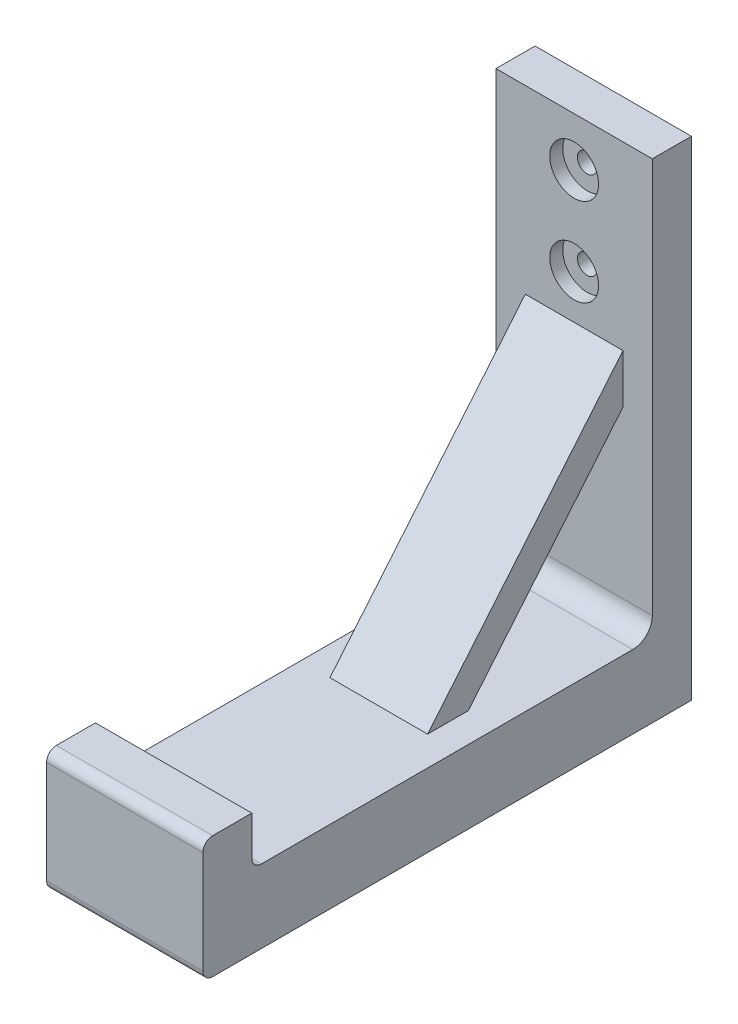
ISO-10303-21;
HEADER;
FILE_DESCRIPTION(('STEP AP214'),'2;1');
FILE_NAME('part.step','',(''),(''),'','','');
FILE_SCHEMA(('AUTOMOTIVE_DESIGN { 1 0 10303 214 1 1 1 1 }'));
ENDSEC;
DATA;
#1=APPLICATION_CONTEXT('core data for automotive mechanical design processes');
#2=APPLICATION_PROTOCOL_DEFINITION('international standard','automotive_design',2000,#1);
#3=PRODUCT_CONTEXT('',#1,'mechanical');
#4=PRODUCT('Part','Part','',(#3));
#5=PRODUCT_RELATED_PRODUCT_CATEGORY('part','',(#4));
#6=PRODUCT_DEFINITION_FORMATION('','',#4);
#7=PRODUCT_DEFINITION_CONTEXT('part definition',#1,'design');
#8=PRODUCT_DEFINITION('design','',#6,#7);
#9=PRODUCT_DEFINITION_SHAPE('','',#8);
#10=(LENGTH_UNIT() NAMED_UNIT(*) SI_UNIT(.MILLI.,.METRE.));
#11=(NAMED_UNIT(*) PLANE_ANGLE_UNIT() SI_UNIT($,.RADIAN.));
#12=(NAMED_UNIT(*) SI_UNIT($,.STERADIAN.) SOLID_ANGLE_UNIT());
#13=UNCERTAINTY_MEASURE_WITH_UNIT(LENGTH_MEASURE(1.E-05),#10,'distance_accuracy_value','');
#14=(GEOMETRIC_REPRESENTATION_CONTEXT(3) GLOBAL_UNCERTAINTY_ASSIGNED_CONTEXT((#13)) GLOBAL_UNIT_ASSIGNED_CONTEXT((#10,
#11,#12)) REPRESENTATION_CONTEXT('',''));
#15=CARTESIAN_POINT('',(0.,0.,0.));
#16=DIRECTION('',(0.,0.,1.));
#17=DIRECTION('',(1.,0.,0.));
#18=AXIS2_PLACEMENT_3D('',#15,#16,#17);
#19=CARTESIAN_POINT('',(20.32,127.,10.16));
#20=DIRECTION('',(0.,0.,-1.));
#21=DIRECTION('',(0.,1.,0.));
#22=AXIS2_PLACEMENT_3D('',#19,#20,#21);
#23=PLANE('',#22);
#24=CARTESIAN_POINT('',(0.,91.44,10.16));
#25=DIRECTION('',(0.,0.,1.));
#26=DIRECTION('',(1.,0.,0.));
#27=AXIS2_PLACEMENT_3D('',#24,#25,#26);
#28=CIRCLE('',#27,6.35);
#29=CARTESIAN_POINT('',(6.35,91.44,10.16));
#30=VERTEX_POINT('',#29);
#31=EDGE_CURVE('E361',#30,#30,#28,.T.);
#32=ORIENTED_EDGE('',*,*,#31,.F.);
#33=EDGE_LOOP('',(#32));
#34=FACE_BOUND('',#33,.T.);
#35=CARTESIAN_POINT('',(0.,114.3,10.16));
#36=DIRECTION('',(0.,0.,1.));
#37=DIRECTION('',(1.,0.,0.));
#38=AXIS2_PLACEMENT_3D('',#35,#36,#37);
#39=CIRCLE('',#38,6.35);
#40=CARTESIAN_POINT('',(6.35,114.3,10.16));
#41=VERTEX_POINT('',#40);
#42=EDGE_CURVE('E343',#41,#41,#39,.T.);
#43=ORIENTED_EDGE('',*,*,#42,.F.);
#44=EDGE_LOOP('',(#43));
#45=FACE_BOUND('',#44,.T.);
#46=DIRECTION('',(0.,-1.,0.));
#47=VECTOR('',#46,1.);
#48=CARTESIAN_POINT('',(-20.32,127.,10.16));
#49=LINE('',#48,#47);
#50=CARTESIAN_POINT('',(-20.32,127.,10.16));
#51=VERTEX_POINT('',#50);
#52=CARTESIAN_POINT('',(-20.32,24.13,10.16));
#53=VERTEX_POINT('',#52);
#54=EDGE_CURVE('E240',#51,#53,#49,.T.);
#55=ORIENTED_EDGE('',*,*,#54,.T.);
#56=DIRECTION('',(-1.,0.,0.));
#57=VECTOR('',#56,1.);
#58=CARTESIAN_POINT('',(20.32,24.13,10.16));
#59=LINE('',#58,#57);
#60=CARTESIAN_POINT('',(20.32,24.13,10.16));
#61=VERTEX_POINT('',#60);
#62=EDGE_CURVE('E275',#53,#61,#59,.F.);
#63=ORIENTED_EDGE('',*,*,#62,.T.);
#64=DIRECTION('',(0.,-1.,0.));
#65=VECTOR('',#64,1.);
#66=CARTESIAN_POINT('',(20.32,127.,10.16));
#67=LINE('',#66,#65);
#68=CARTESIAN_POINT('',(20.32,127.,10.16));
#69=VERTEX_POINT('',#68);
#70=EDGE_CURVE('E212',#69,#61,#67,.T.);
#71=ORIENTED_EDGE('',*,*,#70,.F.);
#72=DIRECTION('',(-1.,0.,0.));
#73=VECTOR('',#72,1.);
#74=CARTESIAN_POINT('',(20.32,127.,10.16));
#75=LINE('',#74,#73);
#76=EDGE_CURVE('E257',#69,#51,#75,.T.);
#77=ORIENTED_EDGE('',*,*,#76,.T.);
#78=EDGE_LOOP('',(#55,#63,#71,#77));
#79=FACE_BOUND('',#78,.T.);
#80=DIRECTION('',(-1.,0.,0.));
#81=VECTOR('',#80,1.);
#82=CARTESIAN_POINT('',(12.7,80.01,10.16));
#83=LINE('',#82,#81);
#84=CARTESIAN_POINT('',(12.7,80.01,10.16));
#85=VERTEX_POINT('',#84);
#86=CARTESIAN_POINT('',(-12.7,80.01,10.16));
#87=VERTEX_POINT('',#86);
#88=EDGE_CURVE('E167',#85,#87,#83,.T.);
#89=ORIENTED_EDGE('',*,*,#88,.F.);
#90=DIRECTION('',(0.,1.,0.));
#91=VECTOR('',#90,1.);
#92=CARTESIAN_POINT('',(12.7,67.31,10.16));
#93=LINE('',#92,#91);
#94=CARTESIAN_POINT('',(12.7,67.31,10.16));
#95=VERTEX_POINT('',#94);
#96=EDGE_CURVE('E165',#95,#85,#93,.T.);
#97=ORIENTED_EDGE('',*,*,#96,.F.);
#98=DIRECTION('',(-1.,0.,0.));
#99=VECTOR('',#98,1.);
#100=CARTESIAN_POINT('',(12.7,67.31,10.16));
#101=LINE('',#100,#99);
#102=CARTESIAN_POINT('',(-12.7,67.31,10.16));
#103=VERTEX_POINT('',#102);
#104=EDGE_CURVE('E156',#95,#103,#101,.T.);
#105=ORIENTED_EDGE('',*,*,#104,.T.);
#106=DIRECTION('',(0.,1.,0.));
#107=VECTOR('',#106,1.);
#108=CARTESIAN_POINT('',(-12.7,67.31,10.16));
#109=LINE('',#108,#107);
#110=EDGE_CURVE('E163',#103,#87,#109,.T.);
#111=ORIENTED_EDGE('',*,*,#110,.T.);
#112=EDGE_LOOP('',(#89,#97,#105,#111));
#113=FACE_BOUND('',#112,.T.);
#114=ADVANCED_FACE('F44',(#34,#45,#79,#113),#23,.F.);
#115=CARTESIAN_POINT('',(20.32,19.05,10.16));
#116=DIRECTION('',(0.,-1.,0.));
#117=DIRECTION('',(0.,0.,-1.));
#118=AXIS2_PLACEMENT_3D('',#115,#116,#117);
#119=PLANE('',#118);
#120=DIRECTION('',(0.,0.,1.));
#121=VECTOR('',#120,1.);
#122=CARTESIAN_POINT('',(-20.32,19.05,10.16));
#123=LINE('',#122,#121);
#124=CARTESIAN_POINT('',(-20.32,19.05,15.24));
#125=VERTEX_POINT('',#124);
#126=CARTESIAN_POINT('',(-20.32,19.05,111.76));
#127=VERTEX_POINT('',#126);
#128=EDGE_CURVE('E241',#125,#127,#123,.T.);
#129=ORIENTED_EDGE('',*,*,#128,.T.);
#130=DIRECTION('',(-1.,0.,0.));
#131=VECTOR('',#130,1.);
#132=CARTESIAN_POINT('',(20.32,19.05,111.76));
#133=LINE('',#132,#131);
#134=CARTESIAN_POINT('',(20.32,19.05,111.76));
#135=VERTEX_POINT('',#134);
#136=EDGE_CURVE('E284',#127,#135,#133,.F.);
#137=ORIENTED_EDGE('',*,*,#136,.T.);
#138=DIRECTION('',(0.,0.,1.));
#139=VECTOR('',#138,1.);
#140=CARTESIAN_POINT('',(20.32,19.05,10.16));
#141=LINE('',#140,#139);
#142=CARTESIAN_POINT('',(20.32,19.05,15.24));
#143=VERTEX_POINT('',#142);
#144=EDGE_CURVE('E213',#143,#135,#141,.T.);
#145=ORIENTED_EDGE('',*,*,#144,.F.);
#146=DIRECTION('',(-1.,0.,0.));
#147=VECTOR('',#146,1.);
#148=CARTESIAN_POINT('',(-20.32,19.05,15.24));
#149=LINE('',#148,#147);
#150=EDGE_CURVE('E266',#143,#125,#149,.T.);
#151=ORIENTED_EDGE('',*,*,#150,.T.);
#152=EDGE_LOOP('',(#129,#137,#145,#151));
#153=FACE_BOUND('',#152,.T.);
#154=DIRECTION('',(0.,0.,-1.));
#155=VECTOR('',#154,1.);
#156=CARTESIAN_POINT('',(12.7,19.05,60.96));
#157=LINE('',#156,#155);
#158=CARTESIAN_POINT('',(12.7,19.05,60.96));
#159=VERTEX_POINT('',#158);
#160=CARTESIAN_POINT('',(12.7,19.05,50.3766666666666));
#161=VERTEX_POINT('',#160);
#162=EDGE_CURVE('E189',#159,#161,#157,.T.);
#163=ORIENTED_EDGE('',*,*,#162,.F.);
#164=DIRECTION('',(-1.,0.,0.));
#165=VECTOR('',#164,1.);
#166=CARTESIAN_POINT('',(12.7,19.05,60.96));
#167=LINE('',#166,#165);
#168=CARTESIAN_POINT('',(-12.7,19.05,60.96));
#169=VERTEX_POINT('',#168);
#170=EDGE_CURVE('E195',#159,#169,#167,.T.);
#171=ORIENTED_EDGE('',*,*,#170,.T.);
#172=DIRECTION('',(0.,0.,-1.));
#173=VECTOR('',#172,1.);
#174=CARTESIAN_POINT('',(-12.7,19.05,60.96));
#175=LINE('',#174,#173);
#176=CARTESIAN_POINT('',(-12.7,19.05,50.3766666666667));
#177=VERTEX_POINT('',#176);
#178=EDGE_CURVE('E177',#169,#177,#175,.T.);
#179=ORIENTED_EDGE('',*,*,#178,.T.);
#180=DIRECTION('',(-1.,0.,0.));
#181=VECTOR('',#180,1.);
#182=CARTESIAN_POINT('',(12.7,19.05,50.3766666666667));
#183=LINE('',#182,#181);
#184=EDGE_CURVE('E169',#161,#177,#183,.T.);
#185=ORIENTED_EDGE('',*,*,#184,.F.);
#186=EDGE_LOOP('',(#163,#171,#179,#185));
#187=FACE_BOUND('',#186,.T.);
#188=ADVANCED_FACE('F375',(#153,#187),#119,.F.);
#189=CARTESIAN_POINT('',(20.32,0.,127.));
#190=DIRECTION('',(0.,1.,0.));
#191=DIRECTION('',(0.,0.,1.));
#192=AXIS2_PLACEMENT_3D('',#189,#190,#191);
#193=PLANE('',#192);
#194=DIRECTION('',(0.,0.,-1.));
#195=VECTOR('',#194,1.);
#196=CARTESIAN_POINT('',(20.32,0.,127.));
#197=LINE('',#196,#195);
#198=CARTESIAN_POINT('',(20.32,0.,124.46));
#199=VERTEX_POINT('',#198);
#200=CARTESIAN_POINT('',(20.32,0.,0.));
#201=VERTEX_POINT('',#200);
#202=EDGE_CURVE('E203',#199,#201,#197,.T.);
#203=ORIENTED_EDGE('',*,*,#202,.F.);
#204=DIRECTION('',(-1.,0.,0.));
#205=VECTOR('',#204,1.);
#206=CARTESIAN_POINT('',(20.32,0.,124.46));
#207=LINE('',#206,#205);
#208=CARTESIAN_POINT('',(-20.32,0.,124.46));
#209=VERTEX_POINT('',#208);
#210=EDGE_CURVE('E295',#199,#209,#207,.T.);
#211=ORIENTED_EDGE('',*,*,#210,.T.);
#212=DIRECTION('',(0.,0.,-1.));
#213=VECTOR('',#212,1.);
#214=CARTESIAN_POINT('',(-20.32,0.,127.));
#215=LINE('',#214,#213);
#216=CARTESIAN_POINT('',(-20.32,0.,0.));
#217=VERTEX_POINT('',#216);
#218=EDGE_CURVE('E199',#209,#217,#215,.T.);
#219=ORIENTED_EDGE('',*,*,#218,.T.);
#220=DIRECTION('',(-1.,0.,0.));
#221=VECTOR('',#220,1.);
#222=CARTESIAN_POINT('',(20.32,0.,0.));
#223=LINE('',#222,#221);
#224=EDGE_CURVE('E263',#201,#217,#223,.T.);
#225=ORIENTED_EDGE('',*,*,#224,.F.);
#226=EDGE_LOOP('',(#203,#211,#219,#225));
#227=FACE_BOUND('',#226,.T.);
#228=ADVANCED_FACE('F417',(#227),#193,.F.);
#229=CARTESIAN_POINT('',(20.32,0.,0.));
#230=DIRECTION('',(0.,0.,1.));
#231=DIRECTION('',(1.,0.,0.));
#232=AXIS2_PLACEMENT_3D('',#229,#230,#231);
#233=PLANE('',#232);
#234=CARTESIAN_POINT('',(0.,91.44,0.));
#235=DIRECTION('',(0.,0.,1.));
#236=DIRECTION('',(1.,0.,0.));
#237=AXIS2_PLACEMENT_3D('',#234,#235,#236);
#238=CIRCLE('',#237,2.54);
#239=CARTESIAN_POINT('',(2.54,91.44,0.));
#240=VERTEX_POINT('',#239);
#241=EDGE_CURVE('E353',#240,#240,#238,.T.);
#242=ORIENTED_EDGE('',*,*,#241,.T.);
#243=EDGE_LOOP('',(#242));
#244=FACE_BOUND('',#243,.T.);
#245=CARTESIAN_POINT('',(0.,114.3,0.));
#246=DIRECTION('',(0.,0.,1.));
#247=DIRECTION('',(1.,0.,0.));
#248=AXIS2_PLACEMENT_3D('',#245,#246,#247);
#249=CIRCLE('',#248,2.54);
#250=CARTESIAN_POINT('',(2.54,114.3,0.));
#251=VERTEX_POINT('',#250);
#252=EDGE_CURVE('E328',#251,#251,#249,.T.);
#253=ORIENTED_EDGE('',*,*,#252,.T.);
#254=EDGE_LOOP('',(#253));
#255=FACE_BOUND('',#254,.T.);
#256=DIRECTION('',(0.,1.,0.));
#257=VECTOR('',#256,1.);
#258=CARTESIAN_POINT('',(-20.32,0.,0.));
#259=LINE('',#258,#257);
#260=CARTESIAN_POINT('',(-20.32,127.,0.));
#261=VERTEX_POINT('',#260);
#262=EDGE_CURVE('E233',#217,#261,#259,.T.);
#263=ORIENTED_EDGE('',*,*,#262,.T.);
#264=DIRECTION('',(-1.,0.,0.));
#265=VECTOR('',#264,1.);
#266=CARTESIAN_POINT('',(20.32,127.,0.));
#267=LINE('',#266,#265);
#268=CARTESIAN_POINT('',(20.32,127.,0.));
#269=VERTEX_POINT('',#268);
#270=EDGE_CURVE('E258',#269,#261,#267,.T.);
#271=ORIENTED_EDGE('',*,*,#270,.F.);
#272=DIRECTION('',(0.,1.,0.));
#273=VECTOR('',#272,1.);
#274=CARTESIAN_POINT('',(20.32,0.,0.));
#275=LINE('',#274,#273);
#276=EDGE_CURVE('E202',#201,#269,#275,.T.);
#277=ORIENTED_EDGE('',*,*,#276,.F.);
#278=ORIENTED_EDGE('',*,*,#224,.T.);
#279=EDGE_LOOP('',(#263,#271,#277,#278));
#280=FACE_BOUND('',#279,.T.);
#281=ADVANCED_FACE('F423',(#244,#255,#280),#233,.F.);
#282=CARTESIAN_POINT('',(20.32,127.,0.));
#283=DIRECTION('',(0.,-1.,0.));
#284=DIRECTION('',(0.,0.,-1.));
#285=AXIS2_PLACEMENT_3D('',#282,#283,#284);
#286=PLANE('',#285);
#287=DIRECTION('',(0.,0.,1.));
#288=VECTOR('',#287,1.);
#289=CARTESIAN_POINT('',(-20.32,127.,0.));
#290=LINE('',#289,#288);
#291=EDGE_CURVE('E234',#261,#51,#290,.T.);
#292=ORIENTED_EDGE('',*,*,#291,.T.);
#293=ORIENTED_EDGE('',*,*,#76,.F.);
#294=DIRECTION('',(0.,0.,1.));
#295=VECTOR('',#294,1.);
#296=CARTESIAN_POINT('',(20.32,127.,0.));
#297=LINE('',#296,#295);
#298=EDGE_CURVE('E206',#269,#69,#297,.T.);
#299=ORIENTED_EDGE('',*,*,#298,.F.);
#300=ORIENTED_EDGE('',*,*,#270,.T.);
#301=EDGE_LOOP('',(#292,#293,#299,#300));
#302=FACE_BOUND('',#301,.T.);
#303=ADVANCED_FACE('F424',(#302),#286,.F.);
#304=CARTESIAN_POINT('',(20.32,19.05,114.3));
#305=DIRECTION('',(0.,0.,1.));
#306=DIRECTION('',(0.,-1.,0.));
#307=AXIS2_PLACEMENT_3D('',#304,#305,#306);
#308=PLANE('',#307);
#309=DIRECTION('',(0.,1.,0.));
#310=VECTOR('',#309,1.);
#311=CARTESIAN_POINT('',(20.32,19.05,114.3));
#312=LINE('',#311,#310);
#313=CARTESIAN_POINT('',(20.32,21.59,114.3));
#314=VERTEX_POINT('',#313);
#315=CARTESIAN_POINT('',(20.32,31.75,114.3));
#316=VERTEX_POINT('',#315);
#317=EDGE_CURVE('E218',#314,#316,#312,.T.);
#318=ORIENTED_EDGE('',*,*,#317,.F.);
#319=DIRECTION('',(-1.,0.,0.));
#320=VECTOR('',#319,1.);
#321=CARTESIAN_POINT('',(-20.32,21.59,114.3));
#322=LINE('',#321,#320);
#323=CARTESIAN_POINT('',(-20.32,21.59,114.3));
#324=VERTEX_POINT('',#323);
#325=EDGE_CURVE('E281',#314,#324,#322,.T.);
#326=ORIENTED_EDGE('',*,*,#325,.T.);
#327=DIRECTION('',(0.,1.,0.));
#328=VECTOR('',#327,1.);
#329=CARTESIAN_POINT('',(-20.32,19.05,114.3));
#330=LINE('',#329,#328);
#331=CARTESIAN_POINT('',(-20.32,31.75,114.3));
#332=VERTEX_POINT('',#331);
#333=EDGE_CURVE('E244',#324,#332,#330,.T.);
#334=ORIENTED_EDGE('',*,*,#333,.T.);
#335=DIRECTION('',(-1.,0.,0.));
#336=VECTOR('',#335,1.);
#337=CARTESIAN_POINT('',(20.32,31.75,114.3));
#338=LINE('',#337,#336);
#339=EDGE_CURVE('E226',#316,#332,#338,.T.);
#340=ORIENTED_EDGE('',*,*,#339,.F.);
#341=EDGE_LOOP('',(#318,#326,#334,#340));
#342=FACE_BOUND('',#341,.T.);
#343=ADVANCED_FACE('F396',(#342),#308,.F.);
#344=CARTESIAN_POINT('',(20.32,31.75,114.3));
#345=DIRECTION('',(0.,-1.,0.));
#346=DIRECTION('',(0.,0.,-1.));
#347=AXIS2_PLACEMENT_3D('',#344,#345,#346);
#348=PLANE('',#347);
#349=DIRECTION('',(0.,0.,1.));
#350=VECTOR('',#349,1.);
#351=CARTESIAN_POINT('',(-20.32,31.75,114.3));
#352=LINE('',#351,#350);
#353=CARTESIAN_POINT('',(-20.32,31.75,124.46));
#354=VERTEX_POINT('',#353);
#355=EDGE_CURVE('E247',#332,#354,#352,.T.);
#356=ORIENTED_EDGE('',*,*,#355,.T.);
#357=DIRECTION('',(-1.,0.,0.));
#358=VECTOR('',#357,1.);
#359=CARTESIAN_POINT('',(20.32,31.75,124.46));
#360=LINE('',#359,#358);
#361=CARTESIAN_POINT('',(20.32,31.75,124.46));
#362=VERTEX_POINT('',#361);
#363=EDGE_CURVE('E53',#354,#362,#360,.F.);
#364=ORIENTED_EDGE('',*,*,#363,.T.);
#365=DIRECTION('',(0.,0.,1.));
#366=VECTOR('',#365,1.);
#367=CARTESIAN_POINT('',(20.32,31.75,114.3));
#368=LINE('',#367,#366);
#369=EDGE_CURVE('E225',#316,#362,#368,.T.);
#370=ORIENTED_EDGE('',*,*,#369,.F.);
#371=ORIENTED_EDGE('',*,*,#339,.T.);
#372=EDGE_LOOP('',(#356,#364,#370,#371));
#373=FACE_BOUND('',#372,.T.);
#374=ADVANCED_FACE('F399',(#373),#348,.F.);
#375=CARTESIAN_POINT('',(20.32,31.75,127.));
#376=DIRECTION('',(0.,0.,-1.));
#377=DIRECTION('',(-1.,0.,0.));
#378=AXIS2_PLACEMENT_3D('',#375,#376,#377);
#379=PLANE('',#378);
#380=DIRECTION('',(0.,-1.,0.));
#381=VECTOR('',#380,1.);
#382=CARTESIAN_POINT('',(20.32,31.75,127.));
#383=LINE('',#382,#381);
#384=CARTESIAN_POINT('',(20.32,29.21,127.));
#385=VERTEX_POINT('',#384);
#386=CARTESIAN_POINT('',(20.32,2.54,127.));
#387=VERTEX_POINT('',#386);
#388=EDGE_CURVE('E224',#385,#387,#383,.T.);
#389=ORIENTED_EDGE('',*,*,#388,.F.);
#390=DIRECTION('',(-1.,0.,0.));
#391=VECTOR('',#390,1.);
#392=CARTESIAN_POINT('',(20.32,29.21,127.));
#393=LINE('',#392,#391);
#394=CARTESIAN_POINT('',(-20.32,29.21,127.));
#395=VERTEX_POINT('',#394);
#396=EDGE_CURVE('E307',#385,#395,#393,.T.);
#397=ORIENTED_EDGE('',*,*,#396,.T.);
#398=DIRECTION('',(0.,-1.,0.));
#399=VECTOR('',#398,1.);
#400=CARTESIAN_POINT('',(-20.32,31.75,127.));
#401=LINE('',#400,#399);
#402=CARTESIAN_POINT('',(-20.32,2.54,127.));
#403=VERTEX_POINT('',#402);
#404=EDGE_CURVE('E204',#395,#403,#401,.T.);
#405=ORIENTED_EDGE('',*,*,#404,.T.);
#406=DIRECTION('',(-1.,0.,0.));
#407=VECTOR('',#406,1.);
#408=CARTESIAN_POINT('',(20.32,2.54,127.));
#409=LINE('',#408,#407);
#410=EDGE_CURVE('E305',#403,#387,#409,.F.);
#411=ORIENTED_EDGE('',*,*,#410,.T.);
#412=EDGE_LOOP('',(#389,#397,#405,#411));
#413=FACE_BOUND('',#412,.T.);
#414=ADVANCED_FACE('F407',(#413),#379,.F.);
#415=CARTESIAN_POINT('',(20.32,0.,0.));
#416=DIRECTION('',(1.,0.,0.));
#417=DIRECTION('',(0.,0.,-1.));
#418=AXIS2_PLACEMENT_3D('',#415,#416,#417);
#419=PLANE('',#418);
#420=ORIENTED_EDGE('',*,*,#369,.T.);
#421=CARTESIAN_POINT('',(20.32,29.21,124.46));
#422=DIRECTION('',(1.,0.,0.));
#423=DIRECTION('',(0.,0.,-1.));
#424=AXIS2_PLACEMENT_3D('',#421,#422,#423);
#425=CIRCLE('',#424,2.54);
#426=EDGE_CURVE('E11',#362,#385,#425,.T.);
#427=ORIENTED_EDGE('',*,*,#426,.T.);
#428=ORIENTED_EDGE('',*,*,#388,.T.);
#429=CARTESIAN_POINT('',(20.32,2.54,124.46));
#430=DIRECTION('',(1.,0.,0.));
#431=DIRECTION('',(0.,0.,-1.));
#432=AXIS2_PLACEMENT_3D('',#429,#430,#431);
#433=CIRCLE('',#432,2.54);
#434=EDGE_CURVE('E306',#387,#199,#433,.T.);
#435=ORIENTED_EDGE('',*,*,#434,.T.);
#436=ORIENTED_EDGE('',*,*,#202,.T.);
#437=ORIENTED_EDGE('',*,*,#276,.T.);
#438=ORIENTED_EDGE('',*,*,#298,.T.);
#439=ORIENTED_EDGE('',*,*,#70,.T.);
#440=CARTESIAN_POINT('',(20.32,24.13,15.24));
#441=DIRECTION('',(1.,0.,0.));
#442=DIRECTION('',(0.,0.,-1.));
#443=AXIS2_PLACEMENT_3D('',#440,#441,#442);
#444=CIRCLE('',#443,5.08);
#445=EDGE_CURVE('E279',#61,#143,#444,.F.);
#446=ORIENTED_EDGE('',*,*,#445,.T.);
#447=ORIENTED_EDGE('',*,*,#144,.T.);
#448=CARTESIAN_POINT('',(20.32,21.59,111.76));
#449=DIRECTION('',(1.,0.,0.));
#450=DIRECTION('',(0.,0.,-1.));
#451=AXIS2_PLACEMENT_3D('',#448,#449,#450);
#452=CIRCLE('',#451,2.54);
#453=EDGE_CURVE('E293',#135,#314,#452,.F.);
#454=ORIENTED_EDGE('',*,*,#453,.T.);
#455=ORIENTED_EDGE('',*,*,#317,.T.);
#456=EDGE_LOOP('',(#420,#427,#428,#435,#436,#437,#438,#439,#446,#447,#454,#455));
#457=FACE_BOUND('',#456,.T.);
#458=ADVANCED_FACE('F390',(#457),#419,.T.);
#459=CARTESIAN_POINT('',(-20.32,0.,0.));
#460=DIRECTION('',(1.,0.,0.));
#461=DIRECTION('',(0.,0.,-1.));
#462=AXIS2_PLACEMENT_3D('',#459,#460,#461);
#463=PLANE('',#462);
#464=ORIENTED_EDGE('',*,*,#404,.F.);
#465=CARTESIAN_POINT('',(-20.32,29.21,124.46));
#466=DIRECTION('',(1.,0.,0.));
#467=DIRECTION('',(0.,0.,-1.));
#468=AXIS2_PLACEMENT_3D('',#465,#466,#467);
#469=CIRCLE('',#468,2.54);
#470=EDGE_CURVE('E67',#395,#354,#469,.F.);
#471=ORIENTED_EDGE('',*,*,#470,.T.);
#472=ORIENTED_EDGE('',*,*,#355,.F.);
#473=ORIENTED_EDGE('',*,*,#333,.F.);
#474=CARTESIAN_POINT('',(-20.32,21.59,111.76));
#475=DIRECTION('',(1.,0.,0.));
#476=DIRECTION('',(0.,0.,-1.));
#477=AXIS2_PLACEMENT_3D('',#474,#475,#476);
#478=CIRCLE('',#477,2.54);
#479=EDGE_CURVE('E286',#324,#127,#478,.T.);
#480=ORIENTED_EDGE('',*,*,#479,.T.);
#481=ORIENTED_EDGE('',*,*,#128,.F.);
#482=CARTESIAN_POINT('',(-20.32,24.13,15.24));
#483=DIRECTION('',(1.,0.,0.));
#484=DIRECTION('',(0.,0.,-1.));
#485=AXIS2_PLACEMENT_3D('',#482,#483,#484);
#486=CIRCLE('',#485,5.08);
#487=EDGE_CURVE('E273',#125,#53,#486,.T.);
#488=ORIENTED_EDGE('',*,*,#487,.T.);
#489=ORIENTED_EDGE('',*,*,#54,.F.);
#490=ORIENTED_EDGE('',*,*,#291,.F.);
#491=ORIENTED_EDGE('',*,*,#262,.F.);
#492=ORIENTED_EDGE('',*,*,#218,.F.);
#493=CARTESIAN_POINT('',(-20.32,2.54,124.46));
#494=DIRECTION('',(1.,0.,0.));
#495=DIRECTION('',(0.,0.,-1.));
#496=AXIS2_PLACEMENT_3D('',#493,#494,#495);
#497=CIRCLE('',#496,2.54);
#498=EDGE_CURVE('E296',#209,#403,#497,.F.);
#499=ORIENTED_EDGE('',*,*,#498,.T.);
#500=EDGE_LOOP('',(#464,#471,#472,#473,#480,#481,#488,#489,#490,#491,#492,#499));
#501=FACE_BOUND('',#500,.T.);
#502=ADVANCED_FACE('F410',(#501),#463,.F.);
#503=CARTESIAN_POINT('',(12.7,19.05,50.3766666666667));
#504=DIRECTION('',(0.,0.64018439966448,0.768221279597376));
#505=DIRECTION('',(0.,-0.768221279597376,0.64018439966448));
#506=AXIS2_PLACEMENT_3D('',#503,#504,#505);
#507=PLANE('',#506);
#508=DIRECTION('',(0.,0.768221279597376,-0.64018439966448));
#509=VECTOR('',#508,1.);
#510=CARTESIAN_POINT('',(-12.7,19.05,50.3766666666667));
#511=LINE('',#510,#509);
#512=EDGE_CURVE('E172',#177,#103,#511,.T.);
#513=ORIENTED_EDGE('',*,*,#512,.T.);
#514=ORIENTED_EDGE('',*,*,#104,.F.);
#515=DIRECTION('',(0.,0.768221279597376,-0.64018439966448));
#516=VECTOR('',#515,1.);
#517=CARTESIAN_POINT('',(12.7,19.05,50.3766666666667));
#518=LINE('',#517,#516);
#519=EDGE_CURVE('E318',#161,#95,#518,.T.);
#520=ORIENTED_EDGE('',*,*,#519,.F.);
#521=ORIENTED_EDGE('',*,*,#184,.T.);
#522=EDGE_LOOP('',(#513,#514,#520,#521));
#523=FACE_BOUND('',#522,.T.);
#524=ADVANCED_FACE('F174',(#523),#507,.F.);
#525=CARTESIAN_POINT('',(12.7,19.05,60.96));
#526=DIRECTION('',(0.,0.64018439966448,0.768221279597376));
#527=DIRECTION('',(0.,-0.768221279597376,0.64018439966448));
#528=AXIS2_PLACEMENT_3D('',#525,#526,#527);
#529=PLANE('',#528);
#530=DIRECTION('',(0.,0.768221279597376,-0.64018439966448));
#531=VECTOR('',#530,1.);
#532=CARTESIAN_POINT('',(-12.7,19.05,60.96));
#533=LINE('',#532,#531);
#534=EDGE_CURVE('E183',#169,#87,#533,.T.);
#535=ORIENTED_EDGE('',*,*,#534,.F.);
#536=ORIENTED_EDGE('',*,*,#170,.F.);
#537=DIRECTION('',(0.,0.768221279597376,-0.64018439966448));
#538=VECTOR('',#537,1.);
#539=CARTESIAN_POINT('',(12.7,19.05,60.96));
#540=LINE('',#539,#538);
#541=EDGE_CURVE('E193',#159,#85,#540,.T.);
#542=ORIENTED_EDGE('',*,*,#541,.T.);
#543=ORIENTED_EDGE('',*,*,#88,.T.);
#544=EDGE_LOOP('',(#535,#536,#542,#543));
#545=FACE_BOUND('',#544,.T.);
#546=ADVANCED_FACE('F597',(#545),#529,.T.);
#547=CARTESIAN_POINT('',(12.7,0.,0.));
#548=DIRECTION('',(1.,0.,0.));
#549=DIRECTION('',(0.,0.,-1.));
#550=AXIS2_PLACEMENT_3D('',#547,#548,#549);
#551=PLANE('',#550);
#552=ORIENTED_EDGE('',*,*,#162,.T.);
#553=ORIENTED_EDGE('',*,*,#519,.T.);
#554=ORIENTED_EDGE('',*,*,#96,.T.);
#555=ORIENTED_EDGE('',*,*,#541,.F.);
#556=EDGE_LOOP('',(#552,#553,#554,#555));
#557=FACE_BOUND('',#556,.T.);
#558=ADVANCED_FACE('F590',(#557),#551,.T.);
#559=CARTESIAN_POINT('',(-12.7,0.,0.));
#560=DIRECTION('',(1.,0.,0.));
#561=DIRECTION('',(0.,0.,-1.));
#562=AXIS2_PLACEMENT_3D('',#559,#560,#561);
#563=PLANE('',#562);
#564=ORIENTED_EDGE('',*,*,#178,.F.);
#565=ORIENTED_EDGE('',*,*,#534,.T.);
#566=ORIENTED_EDGE('',*,*,#110,.F.);
#567=ORIENTED_EDGE('',*,*,#512,.F.);
#568=EDGE_LOOP('',(#564,#565,#566,#567));
#569=FACE_BOUND('',#568,.T.);
#570=ADVANCED_FACE('F185',(#569),#563,.F.);
#571=CARTESIAN_POINT('',(0.,114.3,10.16));
#572=DIRECTION('',(0.,0.,1.));
#573=DIRECTION('',(1.,0.,0.));
#574=AXIS2_PLACEMENT_3D('',#571,#572,#573);
#575=CYLINDRICAL_SURFACE('',#574,2.54);
#576=ORIENTED_EDGE('',*,*,#252,.F.);
#577=EDGE_LOOP('',(#576));
#578=FACE_BOUND('',#577,.T.);
#579=CARTESIAN_POINT('',(0.,114.3,6.78179999999999));
#580=DIRECTION('',(0.,0.,1.));
#581=DIRECTION('',(1.,0.,0.));
#582=AXIS2_PLACEMENT_3D('',#579,#580,#581);
#583=CIRCLE('',#582,2.54);
#584=CARTESIAN_POINT('',(2.54,114.3,6.78179999999999));
#585=VERTEX_POINT('',#584);
#586=EDGE_CURVE('E334',#585,#585,#583,.T.);
#587=ORIENTED_EDGE('',*,*,#586,.T.);
#588=EDGE_LOOP('',(#587));
#589=FACE_BOUND('',#588,.T.);
#590=ADVANCED_FACE('F569',(#578,#589),#575,.F.);
#591=CARTESIAN_POINT('',(2.54,114.3,6.78179999999999));
#592=DIRECTION('',(0.,0.,-1.));
#593=DIRECTION('',(-1.,0.,0.));
#594=AXIS2_PLACEMENT_3D('',#591,#592,#593);
#595=PLANE('',#594);
#596=ORIENTED_EDGE('',*,*,#586,.F.);
#597=EDGE_LOOP('',(#596));
#598=FACE_BOUND('',#597,.T.);
#599=CARTESIAN_POINT('',(0.,114.3,6.78179999999999));
#600=DIRECTION('',(0.,0.,1.));
#601=DIRECTION('',(1.,0.,0.));
#602=AXIS2_PLACEMENT_3D('',#599,#600,#601);
#603=CIRCLE('',#602,6.35);
#604=CARTESIAN_POINT('',(6.35,114.3,6.78179999999999));
#605=VERTEX_POINT('',#604);
#606=EDGE_CURVE('E338',#605,#605,#603,.T.);
#607=ORIENTED_EDGE('',*,*,#606,.T.);
#608=EDGE_LOOP('',(#607));
#609=FACE_BOUND('',#608,.T.);
#610=ADVANCED_FACE('F557',(#598,#609),#595,.F.);
#611=CARTESIAN_POINT('',(0.,114.3,10.16));
#612=DIRECTION('',(0.,0.,1.));
#613=DIRECTION('',(1.,0.,0.));
#614=AXIS2_PLACEMENT_3D('',#611,#612,#613);
#615=CYLINDRICAL_SURFACE('',#614,6.35);
#616=ORIENTED_EDGE('',*,*,#606,.F.);
#617=EDGE_LOOP('',(#616));
#618=FACE_BOUND('',#617,.T.);
#619=ORIENTED_EDGE('',*,*,#42,.T.);
#620=EDGE_LOOP('',(#619));
#621=FACE_BOUND('',#620,.T.);
#622=ADVANCED_FACE('F549',(#618,#621),#615,.F.);
#623=CARTESIAN_POINT('',(0.,91.44,10.16));
#624=DIRECTION('',(0.,0.,1.));
#625=DIRECTION('',(1.,0.,0.));
#626=AXIS2_PLACEMENT_3D('',#623,#624,#625);
#627=CYLINDRICAL_SURFACE('',#626,2.54);
#628=ORIENTED_EDGE('',*,*,#241,.F.);
#629=EDGE_LOOP('',(#628));
#630=FACE_BOUND('',#629,.T.);
#631=CARTESIAN_POINT('',(0.,91.44,6.78179999999999));
#632=DIRECTION('',(0.,0.,1.));
#633=DIRECTION('',(1.,0.,0.));
#634=AXIS2_PLACEMENT_3D('',#631,#632,#633);
#635=CIRCLE('',#634,2.54);
#636=CARTESIAN_POINT('',(2.54,91.44,6.78179999999999));
#637=VERTEX_POINT('',#636);
#638=EDGE_CURVE('E354',#637,#637,#635,.T.);
#639=ORIENTED_EDGE('',*,*,#638,.T.);
#640=EDGE_LOOP('',(#639));
#641=FACE_BOUND('',#640,.T.);
#642=ADVANCED_FACE('F538',(#630,#641),#627,.F.);
#643=CARTESIAN_POINT('',(2.54,91.44,6.78179999999999));
#644=DIRECTION('',(0.,0.,-1.));
#645=DIRECTION('',(-1.,0.,0.));
#646=AXIS2_PLACEMENT_3D('',#643,#644,#645);
#647=PLANE('',#646);
#648=ORIENTED_EDGE('',*,*,#638,.F.);
#649=EDGE_LOOP('',(#648));
#650=FACE_BOUND('',#649,.T.);
#651=CARTESIAN_POINT('',(0.,91.44,6.78179999999999));
#652=DIRECTION('',(0.,0.,1.));
#653=DIRECTION('',(1.,0.,0.));
#654=AXIS2_PLACEMENT_3D('',#651,#652,#653);
#655=CIRCLE('',#654,6.35);
#656=CARTESIAN_POINT('',(6.35,91.44,6.78179999999999));
#657=VERTEX_POINT('',#656);
#658=EDGE_CURVE('E360',#657,#657,#655,.T.);
#659=ORIENTED_EDGE('',*,*,#658,.T.);
#660=EDGE_LOOP('',(#659));
#661=FACE_BOUND('',#660,.T.);
#662=ADVANCED_FACE('F529',(#650,#661),#647,.F.);
#663=CARTESIAN_POINT('',(0.,91.44,10.16));
#664=DIRECTION('',(0.,0.,1.));
#665=DIRECTION('',(1.,0.,0.));
#666=AXIS2_PLACEMENT_3D('',#663,#664,#665);
#667=CYLINDRICAL_SURFACE('',#666,6.35);
#668=ORIENTED_EDGE('',*,*,#658,.F.);
#669=EDGE_LOOP('',(#668));
#670=FACE_BOUND('',#669,.T.);
#671=ORIENTED_EDGE('',*,*,#31,.T.);
#672=EDGE_LOOP('',(#671));
#673=FACE_BOUND('',#672,.T.);
#674=ADVANCED_FACE('F368',(#670,#673),#667,.F.);
#675=CARTESIAN_POINT('',(20.32,24.13,15.24));
#676=DIRECTION('',(1.,0.,0.));
#677=DIRECTION('',(0.,0.,-1.));
#678=AXIS2_PLACEMENT_3D('',#675,#676,#677);
#679=CYLINDRICAL_SURFACE('',#678,5.08);
#680=ORIENTED_EDGE('',*,*,#445,.F.);
#681=ORIENTED_EDGE('',*,*,#62,.F.);
#682=ORIENTED_EDGE('',*,*,#487,.F.);
#683=ORIENTED_EDGE('',*,*,#150,.F.);
#684=EDGE_LOOP('',(#680,#681,#682,#683));
#685=FACE_BOUND('',#684,.T.);
#686=ADVANCED_FACE('F384',(#685),#679,.F.);
#687=CARTESIAN_POINT('',(20.32,21.59,111.76));
#688=DIRECTION('',(1.,0.,0.));
#689=DIRECTION('',(0.,0.,-1.));
#690=AXIS2_PLACEMENT_3D('',#687,#688,#689);
#691=CYLINDRICAL_SURFACE('',#690,2.54);
#692=ORIENTED_EDGE('',*,*,#453,.F.);
#693=ORIENTED_EDGE('',*,*,#136,.F.);
#694=ORIENTED_EDGE('',*,*,#479,.F.);
#695=ORIENTED_EDGE('',*,*,#325,.F.);
#696=EDGE_LOOP('',(#692,#693,#694,#695));
#697=FACE_BOUND('',#696,.T.);
#698=ADVANCED_FACE('F392',(#697),#691,.F.);
#699=CARTESIAN_POINT('',(20.32,2.54,124.46));
#700=DIRECTION('',(-1.,0.,0.));
#701=DIRECTION('',(0.,0.,1.));
#702=AXIS2_PLACEMENT_3D('',#699,#700,#701);
#703=CYLINDRICAL_SURFACE('',#702,2.54);
#704=ORIENTED_EDGE('',*,*,#434,.F.);
#705=ORIENTED_EDGE('',*,*,#410,.F.);
#706=ORIENTED_EDGE('',*,*,#498,.F.);
#707=ORIENTED_EDGE('',*,*,#210,.F.);
#708=EDGE_LOOP('',(#704,#705,#706,#707));
#709=FACE_BOUND('',#708,.T.);
#710=ADVANCED_FACE('F413',(#709),#703,.T.);
#711=CARTESIAN_POINT('',(20.32,29.21,124.46));
#712=DIRECTION('',(-1.,0.,0.));
#713=DIRECTION('',(0.,0.,1.));
#714=AXIS2_PLACEMENT_3D('',#711,#712,#713);
#715=CYLINDRICAL_SURFACE('',#714,2.54);
#716=ORIENTED_EDGE('',*,*,#426,.F.);
#717=ORIENTED_EDGE('',*,*,#363,.F.);
#718=ORIENTED_EDGE('',*,*,#470,.F.);
#719=ORIENTED_EDGE('',*,*,#396,.F.);
#720=EDGE_LOOP('',(#716,#717,#718,#719));
#721=FACE_BOUND('',#720,.T.);
#722=ADVANCED_FACE('F50',(#721),#715,.T.);
#723=CLOSED_SHELL('',(#114,#188,#228,#281,#303,#343,#374,#414,#458,#502,#524,#546,#558,#570,
#590,#610,#622,#642,#662,#674,#686,#698,#710,#722));
#724=MANIFOLD_SOLID_BREP('B2',#723);
#725=ADVANCED_BREP_SHAPE_REPRESENTATION('',(#18,#724),#14);
#726=SHAPE_DEFINITION_REPRESENTATION(#9,#725);
ENDSEC;
END-ISO-10303-21;
